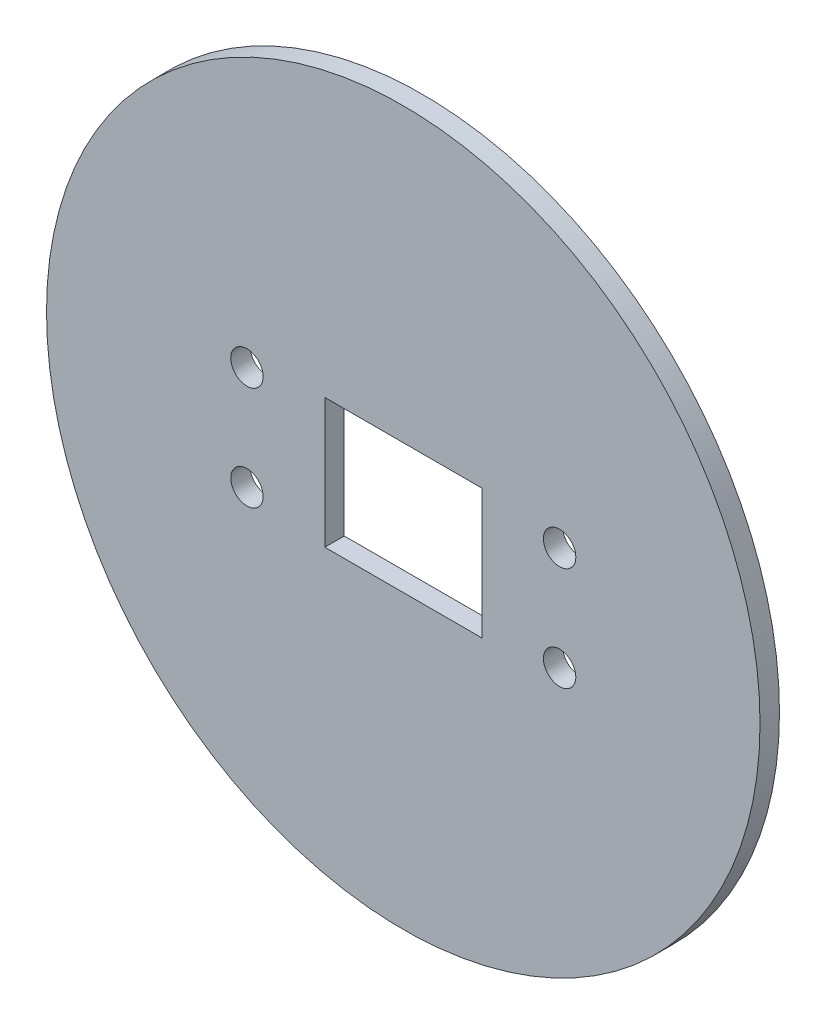
ISO-10303-21;
HEADER;
FILE_DESCRIPTION(('STEP AP214'),'2;1');
FILE_NAME('part.step','',(''),(''),'','','');
FILE_SCHEMA(('AUTOMOTIVE_DESIGN { 1 0 10303 214 1 1 1 1 }'));
ENDSEC;
DATA;
#1=APPLICATION_CONTEXT('core data for automotive mechanical design processes');
#2=APPLICATION_PROTOCOL_DEFINITION('international standard','automotive_design',2000,#1);
#3=PRODUCT_CONTEXT('',#1,'mechanical');
#4=PRODUCT('Part','Part','',(#3));
#5=PRODUCT_RELATED_PRODUCT_CATEGORY('part','',(#4));
#6=PRODUCT_DEFINITION_FORMATION('','',#4);
#7=PRODUCT_DEFINITION_CONTEXT('part definition',#1,'design');
#8=PRODUCT_DEFINITION('design','',#6,#7);
#9=PRODUCT_DEFINITION_SHAPE('','',#8);
#10=(LENGTH_UNIT() NAMED_UNIT(*) SI_UNIT(.MILLI.,.METRE.));
#11=(NAMED_UNIT(*) PLANE_ANGLE_UNIT() SI_UNIT($,.RADIAN.));
#12=(NAMED_UNIT(*) SI_UNIT($,.STERADIAN.) SOLID_ANGLE_UNIT());
#13=UNCERTAINTY_MEASURE_WITH_UNIT(LENGTH_MEASURE(1.E-05),#10,'distance_accuracy_value','');
#14=(GEOMETRIC_REPRESENTATION_CONTEXT(3) GLOBAL_UNCERTAINTY_ASSIGNED_CONTEXT((#13)) GLOBAL_UNIT_ASSIGNED_CONTEXT((#10,
#11,#12)) REPRESENTATION_CONTEXT('',''));
#15=CARTESIAN_POINT('',(0.,0.,0.));
#16=DIRECTION('',(0.,0.,1.));
#17=DIRECTION('',(1.,0.,0.));
#18=AXIS2_PLACEMENT_3D('',#15,#16,#17);
#19=CARTESIAN_POINT('',(0.,0.,1.5));
#20=DIRECTION('',(0.,0.,-1.));
#21=DIRECTION('',(-1.,0.,0.));
#22=AXIS2_PLACEMENT_3D('',#19,#20,#21);
#23=CYLINDRICAL_SURFACE('',#22,27.5);
#24=CARTESIAN_POINT('',(0.,0.,1.5));
#25=DIRECTION('',(0.,0.,1.));
#26=DIRECTION('',(1.,0.,0.));
#27=AXIS2_PLACEMENT_3D('',#24,#25,#26);
#28=CIRCLE('',#27,27.5);
#29=CARTESIAN_POINT('',(27.5,0.,1.5));
#30=VERTEX_POINT('',#29);
#31=EDGE_CURVE('E12',#30,#30,#28,.T.);
#32=ORIENTED_EDGE('',*,*,#31,.F.);
#33=EDGE_LOOP('',(#32));
#34=FACE_BOUND('',#33,.T.);
#35=CARTESIAN_POINT('',(0.,0.,0.));
#36=DIRECTION('',(0.,0.,1.));
#37=DIRECTION('',(1.,0.,0.));
#38=AXIS2_PLACEMENT_3D('',#35,#36,#37);
#39=CIRCLE('',#38,27.5);
#40=CARTESIAN_POINT('',(27.5,0.,0.));
#41=VERTEX_POINT('',#40);
#42=EDGE_CURVE('E58',#41,#41,#39,.T.);
#43=ORIENTED_EDGE('',*,*,#42,.T.);
#44=EDGE_LOOP('',(#43));
#45=FACE_BOUND('',#44,.T.);
#46=ADVANCED_FACE('F50',(#34,#45),#23,.T.);
#47=CARTESIAN_POINT('',(0.,0.,1.5));
#48=DIRECTION('',(0.,0.,1.));
#49=DIRECTION('',(1.,0.,0.));
#50=AXIS2_PLACEMENT_3D('',#47,#48,#49);
#51=PLANE('',#50);
#52=CARTESIAN_POINT('',(-12.05,4.,1.5));
#53=DIRECTION('',(0.,0.,1.));
#54=DIRECTION('',(-1.,0.,0.));
#55=AXIS2_PLACEMENT_3D('',#52,#53,#54);
#56=CIRCLE('',#55,1.25);
#57=CARTESIAN_POINT('',(-13.3,4.,1.5));
#58=VERTEX_POINT('',#57);
#59=EDGE_CURVE('E202',#58,#58,#56,.T.);
#60=ORIENTED_EDGE('',*,*,#59,.F.);
#61=EDGE_LOOP('',(#60));
#62=FACE_BOUND('',#61,.T.);
#63=CARTESIAN_POINT('',(12.05,-4.,1.5));
#64=DIRECTION('',(0.,0.,1.));
#65=DIRECTION('',(-1.,0.,0.));
#66=AXIS2_PLACEMENT_3D('',#63,#64,#65);
#67=CIRCLE('',#66,1.25);
#68=CARTESIAN_POINT('',(10.8,-4.,1.5));
#69=VERTEX_POINT('',#68);
#70=EDGE_CURVE('E203',#69,#69,#67,.T.);
#71=ORIENTED_EDGE('',*,*,#70,.F.);
#72=EDGE_LOOP('',(#71));
#73=FACE_BOUND('',#72,.T.);
#74=CARTESIAN_POINT('',(-12.05,-4.,1.5));
#75=DIRECTION('',(0.,0.,1.));
#76=DIRECTION('',(1.,0.,0.));
#77=AXIS2_PLACEMENT_3D('',#74,#75,#76);
#78=CIRCLE('',#77,1.25);
#79=CARTESIAN_POINT('',(-10.8,-4.,1.5));
#80=VERTEX_POINT('',#79);
#81=EDGE_CURVE('E207',#80,#80,#78,.T.);
#82=ORIENTED_EDGE('',*,*,#81,.F.);
#83=EDGE_LOOP('',(#82));
#84=FACE_BOUND('',#83,.T.);
#85=CARTESIAN_POINT('',(12.05,4.,1.5));
#86=DIRECTION('',(0.,0.,1.));
#87=DIRECTION('',(1.,0.,0.));
#88=AXIS2_PLACEMENT_3D('',#85,#86,#87);
#89=CIRCLE('',#88,1.25);
#90=CARTESIAN_POINT('',(13.3,4.,1.5));
#91=VERTEX_POINT('',#90);
#92=EDGE_CURVE('E114',#91,#91,#89,.T.);
#93=ORIENTED_EDGE('',*,*,#92,.F.);
#94=EDGE_LOOP('',(#93));
#95=FACE_BOUND('',#94,.T.);
#96=DIRECTION('',(1.,0.,0.));
#97=VECTOR('',#96,1.);
#98=CARTESIAN_POINT('',(-6.05,5.,1.5));
#99=LINE('',#98,#97);
#100=CARTESIAN_POINT('',(-6.05,5.,1.5));
#101=VERTEX_POINT('',#100);
#102=CARTESIAN_POINT('',(6.05,5.,1.5));
#103=VERTEX_POINT('',#102);
#104=EDGE_CURVE('E94',#101,#103,#99,.T.);
#105=ORIENTED_EDGE('',*,*,#104,.T.);
#106=DIRECTION('',(0.,-1.,0.));
#107=VECTOR('',#106,1.);
#108=CARTESIAN_POINT('',(6.05,5.,1.5));
#109=LINE('',#108,#107);
#110=CARTESIAN_POINT('',(6.05,-5.,1.5));
#111=VERTEX_POINT('',#110);
#112=EDGE_CURVE('E100',#103,#111,#109,.T.);
#113=ORIENTED_EDGE('',*,*,#112,.T.);
#114=DIRECTION('',(1.,0.,0.));
#115=VECTOR('',#114,1.);
#116=CARTESIAN_POINT('',(-6.05,-5.,1.5));
#117=LINE('',#116,#115);
#118=CARTESIAN_POINT('',(-6.05,-5.,1.5));
#119=VERTEX_POINT('',#118);
#120=EDGE_CURVE('E104',#119,#111,#117,.T.);
#121=ORIENTED_EDGE('',*,*,#120,.F.);
#122=DIRECTION('',(0.,-1.,0.));
#123=VECTOR('',#122,1.);
#124=CARTESIAN_POINT('',(-6.05,5.,1.5));
#125=LINE('',#124,#123);
#126=EDGE_CURVE('E97',#101,#119,#125,.T.);
#127=ORIENTED_EDGE('',*,*,#126,.F.);
#128=EDGE_LOOP('',(#105,#113,#121,#127));
#129=FACE_BOUND('',#128,.T.);
#130=ORIENTED_EDGE('',*,*,#31,.T.);
#131=EDGE_LOOP('',(#130));
#132=FACE_BOUND('',#131,.T.);
#133=ADVANCED_FACE('F106',(#62,#73,#84,#95,#129,#132),#51,.T.);
#134=CARTESIAN_POINT('',(0.,0.,0.));
#135=DIRECTION('',(0.,0.,1.));
#136=DIRECTION('',(1.,0.,0.));
#137=AXIS2_PLACEMENT_3D('',#134,#135,#136);
#138=PLANE('',#137);
#139=CARTESIAN_POINT('',(-12.05,4.,0.));
#140=DIRECTION('',(0.,0.,1.));
#141=DIRECTION('',(1.,0.,0.));
#142=AXIS2_PLACEMENT_3D('',#139,#140,#141);
#143=CIRCLE('',#142,1.25);
#144=CARTESIAN_POINT('',(-10.8,4.,0.));
#145=VERTEX_POINT('',#144);
#146=EDGE_CURVE('E53',#145,#145,#143,.T.);
#147=ORIENTED_EDGE('',*,*,#146,.T.);
#148=EDGE_LOOP('',(#147));
#149=FACE_BOUND('',#148,.T.);
#150=CARTESIAN_POINT('',(12.05,-4.,0.));
#151=DIRECTION('',(0.,0.,1.));
#152=DIRECTION('',(1.,0.,0.));
#153=AXIS2_PLACEMENT_3D('',#150,#151,#152);
#154=CIRCLE('',#153,1.25);
#155=CARTESIAN_POINT('',(13.3,-4.,0.));
#156=VERTEX_POINT('',#155);
#157=EDGE_CURVE('E136',#156,#156,#154,.T.);
#158=ORIENTED_EDGE('',*,*,#157,.T.);
#159=EDGE_LOOP('',(#158));
#160=FACE_BOUND('',#159,.T.);
#161=CARTESIAN_POINT('',(-12.05,-4.,0.));
#162=DIRECTION('',(0.,0.,1.));
#163=DIRECTION('',(1.,0.,0.));
#164=AXIS2_PLACEMENT_3D('',#161,#162,#163);
#165=CIRCLE('',#164,1.25);
#166=CARTESIAN_POINT('',(-10.8,-4.,0.));
#167=VERTEX_POINT('',#166);
#168=EDGE_CURVE('E134',#167,#167,#165,.T.);
#169=ORIENTED_EDGE('',*,*,#168,.T.);
#170=EDGE_LOOP('',(#169));
#171=FACE_BOUND('',#170,.T.);
#172=CARTESIAN_POINT('',(12.05,4.,0.));
#173=DIRECTION('',(0.,0.,1.));
#174=DIRECTION('',(1.,0.,0.));
#175=AXIS2_PLACEMENT_3D('',#172,#173,#174);
#176=CIRCLE('',#175,1.25);
#177=CARTESIAN_POINT('',(13.3,4.,0.));
#178=VERTEX_POINT('',#177);
#179=EDGE_CURVE('E131',#178,#178,#176,.T.);
#180=ORIENTED_EDGE('',*,*,#179,.T.);
#181=EDGE_LOOP('',(#180));
#182=FACE_BOUND('',#181,.T.);
#183=DIRECTION('',(0.,-1.,0.));
#184=VECTOR('',#183,1.);
#185=CARTESIAN_POINT('',(6.05,5.,0.));
#186=LINE('',#185,#184);
#187=CARTESIAN_POINT('',(6.05,5.,0.));
#188=VERTEX_POINT('',#187);
#189=CARTESIAN_POINT('',(6.05,-5.,0.));
#190=VERTEX_POINT('',#189);
#191=EDGE_CURVE('E120',#188,#190,#186,.T.);
#192=ORIENTED_EDGE('',*,*,#191,.F.);
#193=DIRECTION('',(1.,0.,0.));
#194=VECTOR('',#193,1.);
#195=CARTESIAN_POINT('',(-6.05,5.,0.));
#196=LINE('',#195,#194);
#197=CARTESIAN_POINT('',(-6.05,5.,0.));
#198=VERTEX_POINT('',#197);
#199=EDGE_CURVE('E74',#198,#188,#196,.T.);
#200=ORIENTED_EDGE('',*,*,#199,.F.);
#201=DIRECTION('',(0.,-1.,0.));
#202=VECTOR('',#201,1.);
#203=CARTESIAN_POINT('',(-6.05,5.,0.));
#204=LINE('',#203,#202);
#205=CARTESIAN_POINT('',(-6.05,-5.,0.));
#206=VERTEX_POINT('',#205);
#207=EDGE_CURVE('E108',#198,#206,#204,.T.);
#208=ORIENTED_EDGE('',*,*,#207,.T.);
#209=DIRECTION('',(1.,0.,0.));
#210=VECTOR('',#209,1.);
#211=CARTESIAN_POINT('',(-6.05,-5.,0.));
#212=LINE('',#211,#210);
#213=EDGE_CURVE('E111',#206,#190,#212,.T.);
#214=ORIENTED_EDGE('',*,*,#213,.T.);
#215=EDGE_LOOP('',(#192,#200,#208,#214));
#216=FACE_BOUND('',#215,.T.);
#217=ORIENTED_EDGE('',*,*,#42,.F.);
#218=EDGE_LOOP('',(#217));
#219=FACE_BOUND('',#218,.T.);
#220=ADVANCED_FACE('F143',(#149,#160,#171,#182,#216,#219),#138,.F.);
#221=CARTESIAN_POINT('',(-6.05,5.,1.5));
#222=DIRECTION('',(0.,1.,0.));
#223=DIRECTION('',(0.,0.,1.));
#224=AXIS2_PLACEMENT_3D('',#221,#222,#223);
#225=PLANE('',#224);
#226=ORIENTED_EDGE('',*,*,#199,.T.);
#227=DIRECTION('',(0.,0.,-1.));
#228=VECTOR('',#227,1.);
#229=CARTESIAN_POINT('',(6.05,5.,1.5));
#230=LINE('',#229,#228);
#231=EDGE_CURVE('E91',#103,#188,#230,.T.);
#232=ORIENTED_EDGE('',*,*,#231,.F.);
#233=ORIENTED_EDGE('',*,*,#104,.F.);
#234=DIRECTION('',(0.,0.,-1.));
#235=VECTOR('',#234,1.);
#236=CARTESIAN_POINT('',(-6.05,5.,1.5));
#237=LINE('',#236,#235);
#238=EDGE_CURVE('E124',#101,#198,#237,.T.);
#239=ORIENTED_EDGE('',*,*,#238,.T.);
#240=EDGE_LOOP('',(#226,#232,#233,#239));
#241=FACE_BOUND('',#240,.T.);
#242=ADVANCED_FACE('F92',(#241),#225,.F.);
#243=CARTESIAN_POINT('',(-6.05,5.,1.5));
#244=DIRECTION('',(1.,0.,0.));
#245=DIRECTION('',(0.,1.,0.));
#246=AXIS2_PLACEMENT_3D('',#243,#244,#245);
#247=PLANE('',#246);
#248=ORIENTED_EDGE('',*,*,#207,.F.);
#249=ORIENTED_EDGE('',*,*,#238,.F.);
#250=ORIENTED_EDGE('',*,*,#126,.T.);
#251=DIRECTION('',(0.,0.,-1.));
#252=VECTOR('',#251,1.);
#253=CARTESIAN_POINT('',(-6.05,-5.,1.5));
#254=LINE('',#253,#252);
#255=EDGE_CURVE('E126',#119,#206,#254,.T.);
#256=ORIENTED_EDGE('',*,*,#255,.T.);
#257=EDGE_LOOP('',(#248,#249,#250,#256));
#258=FACE_BOUND('',#257,.T.);
#259=ADVANCED_FACE('F173',(#258),#247,.T.);
#260=CARTESIAN_POINT('',(-6.05,-5.,1.5));
#261=DIRECTION('',(0.,1.,0.));
#262=DIRECTION('',(0.,0.,1.));
#263=AXIS2_PLACEMENT_3D('',#260,#261,#262);
#264=PLANE('',#263);
#265=ORIENTED_EDGE('',*,*,#213,.F.);
#266=ORIENTED_EDGE('',*,*,#255,.F.);
#267=ORIENTED_EDGE('',*,*,#120,.T.);
#268=DIRECTION('',(0.,0.,-1.));
#269=VECTOR('',#268,1.);
#270=CARTESIAN_POINT('',(6.05,-5.,1.5));
#271=LINE('',#270,#269);
#272=EDGE_CURVE('E66',#111,#190,#271,.T.);
#273=ORIENTED_EDGE('',*,*,#272,.T.);
#274=EDGE_LOOP('',(#265,#266,#267,#273));
#275=FACE_BOUND('',#274,.T.);
#276=ADVANCED_FACE('F179',(#275),#264,.T.);
#277=CARTESIAN_POINT('',(6.05,5.,1.5));
#278=DIRECTION('',(1.,0.,0.));
#279=DIRECTION('',(0.,0.,-1.));
#280=AXIS2_PLACEMENT_3D('',#277,#278,#279);
#281=PLANE('',#280);
#282=ORIENTED_EDGE('',*,*,#191,.T.);
#283=ORIENTED_EDGE('',*,*,#272,.F.);
#284=ORIENTED_EDGE('',*,*,#112,.F.);
#285=ORIENTED_EDGE('',*,*,#231,.T.);
#286=EDGE_LOOP('',(#282,#283,#284,#285));
#287=FACE_BOUND('',#286,.T.);
#288=ADVANCED_FACE('F101',(#287),#281,.F.);
#289=CARTESIAN_POINT('',(12.05,4.,-8.5));
#290=DIRECTION('',(0.,0.,1.));
#291=DIRECTION('',(1.,0.,0.));
#292=AXIS2_PLACEMENT_3D('',#289,#290,#291);
#293=CYLINDRICAL_SURFACE('',#292,1.25);
#294=ORIENTED_EDGE('',*,*,#92,.T.);
#295=EDGE_LOOP('',(#294));
#296=FACE_BOUND('',#295,.T.);
#297=ORIENTED_EDGE('',*,*,#179,.F.);
#298=EDGE_LOOP('',(#297));
#299=FACE_BOUND('',#298,.T.);
#300=ADVANCED_FACE('F178',(#296,#299),#293,.F.);
#301=CARTESIAN_POINT('',(-12.05,-4.,-8.5));
#302=DIRECTION('',(0.,0.,1.));
#303=DIRECTION('',(1.,0.,0.));
#304=AXIS2_PLACEMENT_3D('',#301,#302,#303);
#305=CYLINDRICAL_SURFACE('',#304,1.25);
#306=ORIENTED_EDGE('',*,*,#81,.T.);
#307=EDGE_LOOP('',(#306));
#308=FACE_BOUND('',#307,.T.);
#309=ORIENTED_EDGE('',*,*,#168,.F.);
#310=EDGE_LOOP('',(#309));
#311=FACE_BOUND('',#310,.T.);
#312=ADVANCED_FACE('F153',(#308,#311),#305,.F.);
#313=CARTESIAN_POINT('',(12.05,-4.,-8.5));
#314=DIRECTION('',(0.,0.,1.));
#315=DIRECTION('',(1.,0.,0.));
#316=AXIS2_PLACEMENT_3D('',#313,#314,#315);
#317=CYLINDRICAL_SURFACE('',#316,1.25);
#318=ORIENTED_EDGE('',*,*,#70,.T.);
#319=EDGE_LOOP('',(#318));
#320=FACE_BOUND('',#319,.T.);
#321=ORIENTED_EDGE('',*,*,#157,.F.);
#322=EDGE_LOOP('',(#321));
#323=FACE_BOUND('',#322,.T.);
#324=ADVANCED_FACE('F147',(#320,#323),#317,.F.);
#325=CARTESIAN_POINT('',(-12.05,4.,-8.5));
#326=DIRECTION('',(0.,0.,1.));
#327=DIRECTION('',(1.,0.,0.));
#328=AXIS2_PLACEMENT_3D('',#325,#326,#327);
#329=CYLINDRICAL_SURFACE('',#328,1.25);
#330=ORIENTED_EDGE('',*,*,#59,.T.);
#331=EDGE_LOOP('',(#330));
#332=FACE_BOUND('',#331,.T.);
#333=ORIENTED_EDGE('',*,*,#146,.F.);
#334=EDGE_LOOP('',(#333));
#335=FACE_BOUND('',#334,.T.);
#336=ADVANCED_FACE('F145',(#332,#335),#329,.F.);
#337=CLOSED_SHELL('',(#46,#133,#220,#242,#259,#276,#288,#300,#312,#324,#336));
#338=MANIFOLD_SOLID_BREP('B2',#337);
#339=ADVANCED_BREP_SHAPE_REPRESENTATION('',(#18,#338),#14);
#340=SHAPE_DEFINITION_REPRESENTATION(#9,#339);
ENDSEC;
END-ISO-10303-21;
